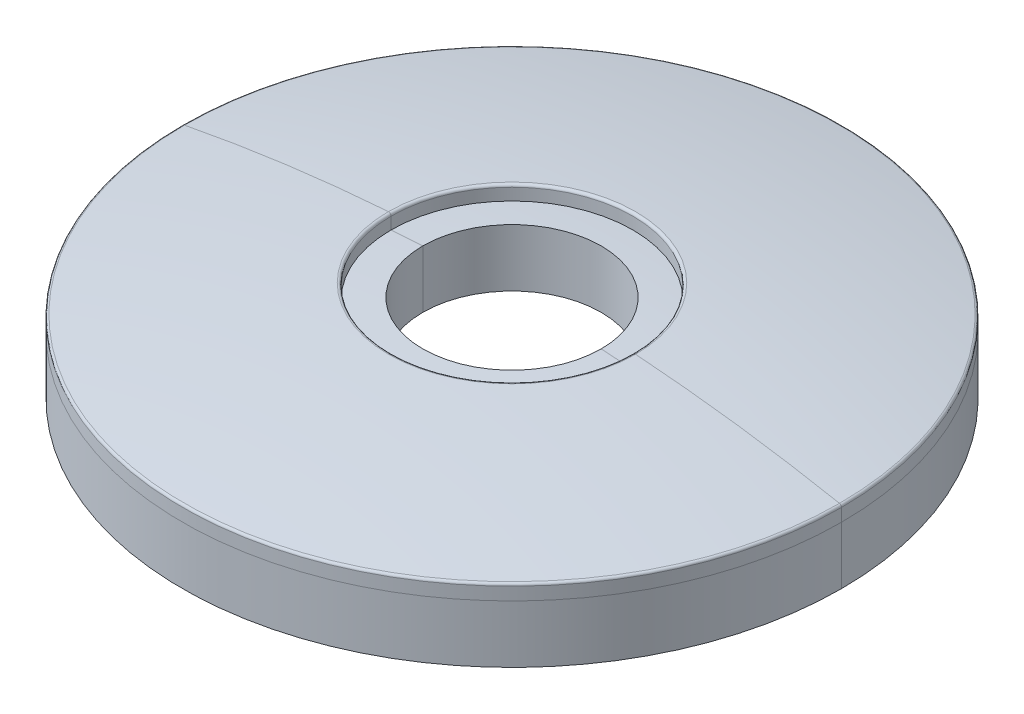
ISO-10303-21;
HEADER;
FILE_DESCRIPTION(('STEP AP214'),'2;1');
FILE_NAME('part.step','',(''),(''),'','','');
FILE_SCHEMA(('AUTOMOTIVE_DESIGN { 1 0 10303 214 1 1 1 1 }'));
ENDSEC;
DATA;
#1=APPLICATION_CONTEXT('core data for automotive mechanical design processes');
#2=APPLICATION_PROTOCOL_DEFINITION('international standard','automotive_design',2000,#1);
#3=PRODUCT_CONTEXT('',#1,'mechanical');
#4=PRODUCT('Part','Part','',(#3));
#5=PRODUCT_RELATED_PRODUCT_CATEGORY('part','',(#4));
#6=PRODUCT_DEFINITION_FORMATION('','',#4);
#7=PRODUCT_DEFINITION_CONTEXT('part definition',#1,'design');
#8=PRODUCT_DEFINITION('design','',#6,#7);
#9=PRODUCT_DEFINITION_SHAPE('','',#8);
#10=(LENGTH_UNIT() NAMED_UNIT(*) SI_UNIT(.MILLI.,.METRE.));
#11=(NAMED_UNIT(*) PLANE_ANGLE_UNIT() SI_UNIT($,.RADIAN.));
#12=(NAMED_UNIT(*) SI_UNIT($,.STERADIAN.) SOLID_ANGLE_UNIT());
#13=UNCERTAINTY_MEASURE_WITH_UNIT(LENGTH_MEASURE(1.E-05),#10,'distance_accuracy_value','');
#14=(GEOMETRIC_REPRESENTATION_CONTEXT(3) GLOBAL_UNCERTAINTY_ASSIGNED_CONTEXT((#13)) GLOBAL_UNIT_ASSIGNED_CONTEXT((#10,
#11,#12)) REPRESENTATION_CONTEXT('',''));
#15=CARTESIAN_POINT('',(0.,0.,0.));
#16=DIRECTION('',(0.,0.,1.));
#17=DIRECTION('',(1.,0.,0.));
#18=AXIS2_PLACEMENT_3D('',#15,#16,#17);
#19=CARTESIAN_POINT('',(0.,-1.4478,0.));
#20=DIRECTION('',(0.,-1.,0.));
#21=DIRECTION('',(1.,0.,0.));
#22=AXIS2_PLACEMENT_3D('',#19,#20,#21);
#23=CYLINDRICAL_SURFACE('',#22,2.5781);
#24=DIRECTION('',(0.,-1.,0.));
#25=VECTOR('',#24,1.);
#26=CARTESIAN_POINT('',(-2.5781,-1.4478,0.));
#27=LINE('',#26,#25);
#28=CARTESIAN_POINT('',(-2.5781,1.08019900598773,0.));
#29=VERTEX_POINT('',#28);
#30=CARTESIAN_POINT('',(-2.5781,-0.583230781246308,0.));
#31=VERTEX_POINT('',#30);
#32=EDGE_CURVE('P0_E150',#29,#31,#27,.T.);
#33=ORIENTED_EDGE('',*,*,#32,.F.);
#34=CARTESIAN_POINT('',(0.,1.08019900598773,0.));
#35=DIRECTION('',(0.,-1.,0.));
#36=DIRECTION('',(1.,0.,0.));
#37=AXIS2_PLACEMENT_3D('',#34,#35,#36);
#38=CIRCLE('',#37,2.5781);
#39=CARTESIAN_POINT('',(2.5781,1.08019900598773,0.));
#40=VERTEX_POINT('',#39);
#41=EDGE_CURVE('P0_E10',#40,#29,#38,.T.);
#42=ORIENTED_EDGE('',*,*,#41,.F.);
#43=DIRECTION('',(0.,-1.,0.));
#44=VECTOR('',#43,1.);
#45=CARTESIAN_POINT('',(2.5781,-1.4478,0.));
#46=LINE('',#45,#44);
#47=CARTESIAN_POINT('',(2.5781,-0.583230781246306,0.));
#48=VERTEX_POINT('',#47);
#49=EDGE_CURVE('P0_E103',#40,#48,#46,.T.);
#50=ORIENTED_EDGE('',*,*,#49,.T.);
#51=CARTESIAN_POINT('',(0.,-0.583230781246307,0.));
#52=DIRECTION('',(0.,-1.,0.));
#53=DIRECTION('',(1.,0.,0.));
#54=AXIS2_PLACEMENT_3D('',#51,#52,#53);
#55=CIRCLE('',#54,2.5781);
#56=EDGE_CURVE('P0_E111',#48,#31,#55,.T.);
#57=ORIENTED_EDGE('',*,*,#56,.T.);
#58=EDGE_LOOP('',(#33,#42,#50,#57));
#59=FACE_BOUND('',#58,.T.);
#60=ADVANCED_FACE('P0_F16',(#59),#23,.F.);
#61=CARTESIAN_POINT('',(0.,-47.9768941011998,0.));
#62=DIRECTION('',(0.,0.,-1.));
#63=DIRECTION('',(-1.,0.,0.));
#64=AXIS2_PLACEMENT_3D('',#61,#62,#63);
#65=SPHERICAL_SURFACE('',#64,49.1247899103626);
#66=CARTESIAN_POINT('',(0.,-47.9768941011998,0.));
#67=DIRECTION('',(0.,0.,-1.));
#68=DIRECTION('',(-1.,0.,0.));
#69=AXIS2_PLACEMENT_3D('',#66,#67,#68);
#70=CIRCLE('',#69,49.1247899103626);
#71=CARTESIAN_POINT('',(9.525,0.215629787234049,0.));
#72=VERTEX_POINT('',#71);
#73=EDGE_CURVE('P0_E97',#40,#72,#70,.T.);
#74=ORIENTED_EDGE('',*,*,#73,.F.);
#75=ORIENTED_EDGE('',*,*,#41,.T.);
#76=CARTESIAN_POINT('',(0.,-47.9768941011998,0.));
#77=DIRECTION('',(0.,0.,1.));
#78=DIRECTION('',(1.,0.,0.));
#79=AXIS2_PLACEMENT_3D('',#76,#77,#78);
#80=CIRCLE('',#79,49.1247899103626);
#81=CARTESIAN_POINT('',(-9.525,0.215629787234043,0.));
#82=VERTEX_POINT('',#81);
#83=EDGE_CURVE('P0_E87',#29,#82,#80,.T.);
#84=ORIENTED_EDGE('',*,*,#83,.T.);
#85=CARTESIAN_POINT('',(0.,0.215629787234047,0.));
#86=DIRECTION('',(0.,-1.,0.));
#87=DIRECTION('',(1.,0.,0.));
#88=AXIS2_PLACEMENT_3D('',#85,#86,#87);
#89=CIRCLE('',#88,9.525);
#90=EDGE_CURVE('P0_E78',#72,#82,#89,.T.);
#91=ORIENTED_EDGE('',*,*,#90,.F.);
#92=EDGE_LOOP('',(#74,#75,#84,#91));
#93=FACE_BOUND('',#92,.T.);
#94=ADVANCED_FACE('P0_F90',(#93),#65,.T.);
#95=CARTESIAN_POINT('',(0.,-1.4478,0.));
#96=DIRECTION('',(0.,-1.,0.));
#97=DIRECTION('',(1.,0.,0.));
#98=AXIS2_PLACEMENT_3D('',#95,#96,#97);
#99=CYLINDRICAL_SURFACE('',#98,9.525);
#100=DIRECTION('',(0.,-1.,0.));
#101=VECTOR('',#100,1.);
#102=CARTESIAN_POINT('',(-9.525,-1.4478,0.));
#103=LINE('',#102,#101);
#104=CARTESIAN_POINT('',(-9.525,-1.4478,0.));
#105=VERTEX_POINT('',#104);
#106=EDGE_CURVE('P0_E67',#82,#105,#103,.T.);
#107=ORIENTED_EDGE('',*,*,#106,.F.);
#108=CARTESIAN_POINT('',(0.,0.215629787234047,0.));
#109=DIRECTION('',(0.,-1.,0.));
#110=DIRECTION('',(1.,0.,0.));
#111=AXIS2_PLACEMENT_3D('',#108,#109,#110);
#112=CIRCLE('',#111,9.525);
#113=EDGE_CURVE('P0_E72',#82,#72,#112,.T.);
#114=ORIENTED_EDGE('',*,*,#113,.T.);
#115=DIRECTION('',(0.,-1.,0.));
#116=VECTOR('',#115,1.);
#117=CARTESIAN_POINT('',(9.525,-1.4478,0.));
#118=LINE('',#117,#116);
#119=CARTESIAN_POINT('',(9.52499999999988,-1.4478,0.));
#120=VERTEX_POINT('',#119);
#121=EDGE_CURVE('P0_E83',#72,#120,#118,.T.);
#122=ORIENTED_EDGE('',*,*,#121,.T.);
#123=CARTESIAN_POINT('',(0.,-1.4478,0.));
#124=DIRECTION('',(0.,-1.,0.));
#125=DIRECTION('',(1.,0.,0.));
#126=AXIS2_PLACEMENT_3D('',#123,#124,#125);
#127=CIRCLE('',#126,9.525);
#128=EDGE_CURVE('P0_E26',#105,#120,#127,.T.);
#129=ORIENTED_EDGE('',*,*,#128,.F.);
#130=EDGE_LOOP('',(#107,#114,#122,#129));
#131=FACE_BOUND('',#130,.T.);
#132=ADVANCED_FACE('P0_F69',(#131),#99,.T.);
#133=CARTESIAN_POINT('',(-1.04083408558608E-13,-49.640323888433,0.));
#134=DIRECTION('',(0.,0.,-1.));
#135=DIRECTION('',(-1.,0.,0.));
#136=AXIS2_PLACEMENT_3D('',#133,#134,#135);
#137=SPHERICAL_SURFACE('',#136,49.1247899103618);
#138=CARTESIAN_POINT('',(-1.04083408558608E-13,-49.640323888433,0.));
#139=DIRECTION('',(0.,0.,-1.));
#140=DIRECTION('',(-1.,0.,0.));
#141=AXIS2_PLACEMENT_3D('',#138,#139,#140);
#142=CIRCLE('',#141,49.1247899103618);
#143=EDGE_CURVE('P0_E116',#48,#120,#142,.T.);
#144=ORIENTED_EDGE('',*,*,#143,.F.);
#145=CARTESIAN_POINT('',(0.,-0.583230781246307,0.));
#146=DIRECTION('',(0.,-1.,0.));
#147=DIRECTION('',(1.,0.,0.));
#148=AXIS2_PLACEMENT_3D('',#145,#146,#147);
#149=CIRCLE('',#148,2.5781);
#150=EDGE_CURVE('P0_E130',#31,#48,#149,.T.);
#151=ORIENTED_EDGE('',*,*,#150,.F.);
#152=CARTESIAN_POINT('',(-1.04083408558608E-13,-49.640323888433,0.));
#153=DIRECTION('',(0.,0.,1.));
#154=DIRECTION('',(1.,0.,0.));
#155=AXIS2_PLACEMENT_3D('',#152,#153,#154);
#156=CIRCLE('',#155,49.1247899103618);
#157=EDGE_CURVE('P0_E19',#31,#105,#156,.T.);
#158=ORIENTED_EDGE('',*,*,#157,.T.);
#159=ORIENTED_EDGE('',*,*,#128,.T.);
#160=EDGE_LOOP('',(#144,#151,#158,#159));
#161=FACE_BOUND('',#160,.T.);
#162=ADVANCED_FACE('P0_F128',(#161),#137,.F.);
#163=CARTESIAN_POINT('',(-1.04083408558608E-13,-49.640323888433,0.));
#164=DIRECTION('',(0.,0.,-1.));
#165=DIRECTION('',(-1.,0.,0.));
#166=AXIS2_PLACEMENT_3D('',#163,#164,#165);
#167=SPHERICAL_SURFACE('',#166,49.1247899103618);
#168=ORIENTED_EDGE('',*,*,#56,.F.);
#169=ORIENTED_EDGE('',*,*,#143,.T.);
#170=CARTESIAN_POINT('',(0.,-1.4478,0.));
#171=DIRECTION('',(0.,-1.,0.));
#172=DIRECTION('',(1.,0.,0.));
#173=AXIS2_PLACEMENT_3D('',#170,#171,#172);
#174=CIRCLE('',#173,9.525);
#175=EDGE_CURVE('P0_E77',#120,#105,#174,.T.);
#176=ORIENTED_EDGE('',*,*,#175,.T.);
#177=ORIENTED_EDGE('',*,*,#157,.F.);
#178=EDGE_LOOP('',(#168,#169,#176,#177));
#179=FACE_BOUND('',#178,.T.);
#180=ADVANCED_FACE('P0_F132',(#179),#167,.F.);
#181=CARTESIAN_POINT('',(0.,-1.4478,0.));
#182=DIRECTION('',(0.,-1.,0.));
#183=DIRECTION('',(1.,0.,0.));
#184=AXIS2_PLACEMENT_3D('',#181,#182,#183);
#185=CYLINDRICAL_SURFACE('',#184,9.525);
#186=ORIENTED_EDGE('',*,*,#90,.T.);
#187=ORIENTED_EDGE('',*,*,#106,.T.);
#188=ORIENTED_EDGE('',*,*,#175,.F.);
#189=ORIENTED_EDGE('',*,*,#121,.F.);
#190=EDGE_LOOP('',(#186,#187,#188,#189));
#191=FACE_BOUND('',#190,.T.);
#192=ADVANCED_FACE('P0_F82',(#191),#185,.T.);
#193=CARTESIAN_POINT('',(0.,-47.9768941011998,0.));
#194=DIRECTION('',(0.,0.,-1.));
#195=DIRECTION('',(-1.,0.,0.));
#196=AXIS2_PLACEMENT_3D('',#193,#194,#195);
#197=SPHERICAL_SURFACE('',#196,49.1247899103626);
#198=CARTESIAN_POINT('',(0.,1.08019900598773,0.));
#199=DIRECTION('',(0.,-1.,0.));
#200=DIRECTION('',(1.,0.,0.));
#201=AXIS2_PLACEMENT_3D('',#198,#199,#200);
#202=CIRCLE('',#201,2.5781);
#203=EDGE_CURVE('P0_E154',#29,#40,#202,.T.);
#204=ORIENTED_EDGE('',*,*,#203,.T.);
#205=ORIENTED_EDGE('',*,*,#73,.T.);
#206=ORIENTED_EDGE('',*,*,#113,.F.);
#207=ORIENTED_EDGE('',*,*,#83,.F.);
#208=EDGE_LOOP('',(#204,#205,#206,#207));
#209=FACE_BOUND('',#208,.T.);
#210=ADVANCED_FACE('P0_F96',(#209),#197,.T.);
#211=CARTESIAN_POINT('',(0.,-1.4478,0.));
#212=DIRECTION('',(0.,-1.,0.));
#213=DIRECTION('',(1.,0.,0.));
#214=AXIS2_PLACEMENT_3D('',#211,#212,#213);
#215=CYLINDRICAL_SURFACE('',#214,2.5781);
#216=ORIENTED_EDGE('',*,*,#203,.F.);
#217=ORIENTED_EDGE('',*,*,#32,.T.);
#218=ORIENTED_EDGE('',*,*,#150,.T.);
#219=ORIENTED_EDGE('',*,*,#49,.F.);
#220=EDGE_LOOP('',(#216,#217,#218,#219));
#221=FACE_BOUND('',#220,.T.);
#222=ADVANCED_FACE('P0_F157',(#221),#215,.F.);
#223=CLOSED_SHELL('',(#60,#94,#132,#162,#180,#192,#210,#222));
#224=MANIFOLD_SOLID_BREP('P0_B1',#223);
#225=CARTESIAN_POINT('',(0.,1.36839752411728,0.));
#226=DIRECTION('',(0.,-1.,0.));
#227=DIRECTION('',(1.,0.,0.));
#228=AXIS2_PLACEMENT_3D('',#225,#226,#227);
#229=TOROIDAL_SURFACE('',#228,3.56643021276595,0.0739302127659569);
#230=CARTESIAN_POINT('',(-3.56643021276596,1.36839752411728,0.));
#231=DIRECTION('',(0.,0.,1.));
#232=DIRECTION('',(1.,0.,0.));
#233=AXIS2_PLACEMENT_3D('',#230,#231,#232);
#234=CIRCLE('',#233,0.073930212765957);
#235=CARTESIAN_POINT('',(-3.4925,1.36839752411728,0.));
#236=VERTEX_POINT('',#235);
#237=CARTESIAN_POINT('',(-3.57175961638411,1.44213539645365,0.));
#238=VERTEX_POINT('',#237);
#239=EDGE_CURVE('P1_E111',#236,#238,#234,.T.);
#240=ORIENTED_EDGE('',*,*,#239,.F.);
#241=CARTESIAN_POINT('',(0.,1.36839752411728,0.));
#242=DIRECTION('',(0.,1.,0.));
#243=DIRECTION('',(1.,0.,0.));
#244=AXIS2_PLACEMENT_3D('',#241,#242,#243);
#245=CIRCLE('',#244,3.4925);
#246=CARTESIAN_POINT('',(3.4925,1.36839752411729,0.));
#247=VERTEX_POINT('',#246);
#248=EDGE_CURVE('P1_E98',#247,#236,#245,.T.);
#249=ORIENTED_EDGE('',*,*,#248,.F.);
#250=CARTESIAN_POINT('',(3.56643021276595,1.36839752411729,0.));
#251=DIRECTION('',(0.,0.,-1.));
#252=DIRECTION('',(-1.,0.,0.));
#253=AXIS2_PLACEMENT_3D('',#250,#251,#252);
#254=CIRCLE('',#253,0.073930212765957);
#255=CARTESIAN_POINT('',(3.57175961638406,1.44213539645365,0.));
#256=VERTEX_POINT('',#255);
#257=EDGE_CURVE('P1_E121',#247,#256,#254,.T.);
#258=ORIENTED_EDGE('',*,*,#257,.T.);
#259=CARTESIAN_POINT('',(0.,1.44213539645365,0.));
#260=DIRECTION('',(0.,-1.,0.));
#261=DIRECTION('',(1.,0.,0.));
#262=AXIS2_PLACEMENT_3D('',#259,#260,#261);
#263=CIRCLE('',#262,3.57175961638409);
#264=EDGE_CURVE('P1_E113',#238,#256,#263,.T.);
#265=ORIENTED_EDGE('',*,*,#264,.F.);
#266=EDGE_LOOP('',(#240,#249,#258,#265));
#267=FACE_BOUND('',#266,.T.);
#268=ADVANCED_FACE('P1_F16',(#267),#229,.T.);
#269=CARTESIAN_POINT('',(0.,0.585998213065722,0.));
#270=DIRECTION('',(0.,-1.,0.));
#271=DIRECTION('',(1.,0.,0.));
#272=AXIS2_PLACEMENT_3D('',#269,#270,#271);
#273=TOROIDAL_SURFACE('',#272,9.45106978723404,0.0739302127659569);
#274=CARTESIAN_POINT('',(-9.45106978723404,0.58599821306572,0.));
#275=DIRECTION('',(0.,0.,1.));
#276=DIRECTION('',(1.,0.,0.));
#277=AXIS2_PLACEMENT_3D('',#274,#275,#276);
#278=CIRCLE('',#277,0.0739302127659575);
#279=CARTESIAN_POINT('',(-9.46519275123856,0.658566927036324,0.));
#280=VERTEX_POINT('',#279);
#281=CARTESIAN_POINT('',(-9.525,0.585998213065719,0.));
#282=VERTEX_POINT('',#281);
#283=EDGE_CURVE('P1_E147',#280,#282,#278,.T.);
#284=ORIENTED_EDGE('',*,*,#283,.F.);
#285=CARTESIAN_POINT('',(0.,0.658566927036329,0.));
#286=DIRECTION('',(0.,1.,0.));
#287=DIRECTION('',(1.,0.,0.));
#288=AXIS2_PLACEMENT_3D('',#285,#286,#287);
#289=CIRCLE('',#288,9.46519275123849);
#290=CARTESIAN_POINT('',(9.4651927512385,0.658566927036327,0.));
#291=VERTEX_POINT('',#290);
#292=EDGE_CURVE('P1_E177',#291,#280,#289,.T.);
#293=ORIENTED_EDGE('',*,*,#292,.F.);
#294=CARTESIAN_POINT('',(9.45106978723404,0.585998213065725,0.));
#295=DIRECTION('',(0.,0.,-1.));
#296=DIRECTION('',(-1.,0.,0.));
#297=AXIS2_PLACEMENT_3D('',#294,#295,#296);
#298=CIRCLE('',#297,0.0739302127659575);
#299=CARTESIAN_POINT('',(9.525,0.585998213065725,0.));
#300=VERTEX_POINT('',#299);
#301=EDGE_CURVE('P1_E152',#291,#300,#298,.T.);
#302=ORIENTED_EDGE('',*,*,#301,.T.);
#303=CARTESIAN_POINT('',(0.,0.585998213065722,0.));
#304=DIRECTION('',(0.,-1.,0.));
#305=DIRECTION('',(1.,0.,0.));
#306=AXIS2_PLACEMENT_3D('',#303,#304,#305);
#307=CIRCLE('',#306,9.525);
#308=EDGE_CURVE('P1_E10',#282,#300,#307,.T.);
#309=ORIENTED_EDGE('',*,*,#308,.F.);
#310=EDGE_LOOP('',(#284,#293,#302,#309));
#311=FACE_BOUND('',#310,.T.);
#312=ADVANCED_FACE('P1_F194',(#311),#273,.T.);
#313=CARTESIAN_POINT('',(0.,-1.4478,0.));
#314=DIRECTION('',(0.,-1.,0.));
#315=DIRECTION('',(1.,0.,0.));
#316=AXIS2_PLACEMENT_3D('',#313,#314,#315);
#317=CYLINDRICAL_SURFACE('',#316,9.525);
#318=DIRECTION('',(0.,-1.,0.));
#319=VECTOR('',#318,1.);
#320=CARTESIAN_POINT('',(-9.525,-1.4478,0.));
#321=LINE('',#320,#319);
#322=CARTESIAN_POINT('',(-9.525,0.215629787234043,0.));
#323=VERTEX_POINT('',#322);
#324=EDGE_CURVE('P1_E135',#282,#323,#321,.T.);
#325=ORIENTED_EDGE('',*,*,#324,.F.);
#326=ORIENTED_EDGE('',*,*,#308,.T.);
#327=DIRECTION('',(0.,-1.,0.));
#328=VECTOR('',#327,1.);
#329=CARTESIAN_POINT('',(9.525,-1.4478,0.));
#330=LINE('',#329,#328);
#331=CARTESIAN_POINT('',(9.525,0.215629787234045,0.));
#332=VERTEX_POINT('',#331);
#333=EDGE_CURVE('P1_E134',#300,#332,#330,.T.);
#334=ORIENTED_EDGE('',*,*,#333,.T.);
#335=CARTESIAN_POINT('',(0.,0.215629787234045,0.));
#336=DIRECTION('',(0.,-1.,0.));
#337=DIRECTION('',(1.,0.,0.));
#338=AXIS2_PLACEMENT_3D('',#335,#336,#337);
#339=CIRCLE('',#338,9.525);
#340=EDGE_CURVE('P1_E24',#323,#332,#339,.T.);
#341=ORIENTED_EDGE('',*,*,#340,.F.);
#342=EDGE_LOOP('',(#325,#326,#334,#341));
#343=FACE_BOUND('',#342,.T.);
#344=ADVANCED_FACE('P1_F204',(#343),#317,.T.);
#345=CARTESIAN_POINT('',(0.,-47.9768941011998,0.));
#346=DIRECTION('',(0.,0.,-1.));
#347=DIRECTION('',(-1.,0.,0.));
#348=AXIS2_PLACEMENT_3D('',#345,#346,#347);
#349=SPHERICAL_SURFACE('',#348,49.1247899103626);
#350=CARTESIAN_POINT('',(0.,-47.9768941011998,0.));
#351=DIRECTION('',(0.,0.,-1.));
#352=DIRECTION('',(-1.,0.,0.));
#353=AXIS2_PLACEMENT_3D('',#350,#351,#352);
#354=CIRCLE('',#353,49.1247899103626);
#355=CARTESIAN_POINT('',(3.4925,1.023589850362,0.));
#356=VERTEX_POINT('',#355);
#357=EDGE_CURVE('P1_E128',#356,#332,#354,.T.);
#358=ORIENTED_EDGE('',*,*,#357,.F.);
#359=CARTESIAN_POINT('',(0.,1.02358985036199,0.));
#360=DIRECTION('',(0.,-1.,0.));
#361=DIRECTION('',(1.,0.,0.));
#362=AXIS2_PLACEMENT_3D('',#359,#360,#361);
#363=CIRCLE('',#362,3.4925);
#364=CARTESIAN_POINT('',(-3.4925,1.02358985036199,0.));
#365=VERTEX_POINT('',#364);
#366=EDGE_CURVE('P1_E37',#365,#356,#363,.T.);
#367=ORIENTED_EDGE('',*,*,#366,.F.);
#368=CARTESIAN_POINT('',(0.,-47.9768941011998,0.));
#369=DIRECTION('',(0.,0.,1.));
#370=DIRECTION('',(1.,0.,0.));
#371=AXIS2_PLACEMENT_3D('',#368,#369,#370);
#372=CIRCLE('',#371,49.1247899103626);
#373=EDGE_CURVE('P1_E107',#365,#323,#372,.T.);
#374=ORIENTED_EDGE('',*,*,#373,.T.);
#375=ORIENTED_EDGE('',*,*,#340,.T.);
#376=EDGE_LOOP('',(#358,#367,#374,#375));
#377=FACE_BOUND('',#376,.T.);
#378=ADVANCED_FACE('P1_F205',(#377),#349,.F.);
#379=CARTESIAN_POINT('',(0.,-1.4478,0.));
#380=DIRECTION('',(0.,-1.,0.));
#381=DIRECTION('',(1.,0.,0.));
#382=AXIS2_PLACEMENT_3D('',#379,#380,#381);
#383=CYLINDRICAL_SURFACE('',#382,3.4925);
#384=DIRECTION('',(0.,-1.,0.));
#385=VECTOR('',#384,1.);
#386=CARTESIAN_POINT('',(-3.4925,-1.4478,0.));
#387=LINE('',#386,#385);
#388=EDGE_CURVE('P1_E88',#236,#365,#387,.T.);
#389=ORIENTED_EDGE('',*,*,#388,.F.);
#390=CARTESIAN_POINT('',(0.,1.36839752411728,0.));
#391=DIRECTION('',(0.,1.,0.));
#392=DIRECTION('',(1.,0.,0.));
#393=AXIS2_PLACEMENT_3D('',#390,#391,#392);
#394=CIRCLE('',#393,3.4925);
#395=EDGE_CURVE('P1_E92',#236,#247,#394,.T.);
#396=ORIENTED_EDGE('',*,*,#395,.T.);
#397=DIRECTION('',(0.,-1.,0.));
#398=VECTOR('',#397,1.);
#399=CARTESIAN_POINT('',(3.4925,-1.4478,0.));
#400=LINE('',#399,#398);
#401=EDGE_CURVE('P1_E48',#247,#356,#400,.T.);
#402=ORIENTED_EDGE('',*,*,#401,.T.);
#403=CARTESIAN_POINT('',(0.,1.02358985036199,0.));
#404=DIRECTION('',(0.,-1.,0.));
#405=DIRECTION('',(1.,0.,0.));
#406=AXIS2_PLACEMENT_3D('',#403,#404,#405);
#407=CIRCLE('',#406,3.4925);
#408=EDGE_CURVE('P1_E94',#356,#365,#407,.T.);
#409=ORIENTED_EDGE('',*,*,#408,.T.);
#410=EDGE_LOOP('',(#389,#396,#402,#409));
#411=FACE_BOUND('',#410,.T.);
#412=ADVANCED_FACE('P1_F90',(#411),#383,.F.);
#413=CARTESIAN_POINT('',(0.,-47.9768941011998,0.));
#414=DIRECTION('',(0.,0.,-1.));
#415=DIRECTION('',(-1.,0.,0.));
#416=AXIS2_PLACEMENT_3D('',#413,#414,#415);
#417=SPHERICAL_SURFACE('',#416,49.5479358121725);
#418=CARTESIAN_POINT('',(0.,-47.9768941011998,0.));
#419=DIRECTION('',(0.,0.,-1.));
#420=DIRECTION('',(-1.,0.,0.));
#421=AXIS2_PLACEMENT_3D('',#418,#419,#420);
#422=CIRCLE('',#421,49.5479358121725);
#423=EDGE_CURVE('P1_E173',#256,#291,#422,.T.);
#424=ORIENTED_EDGE('',*,*,#423,.F.);
#425=CARTESIAN_POINT('',(0.,1.44213539645365,0.));
#426=DIRECTION('',(0.,-1.,0.));
#427=DIRECTION('',(1.,0.,0.));
#428=AXIS2_PLACEMENT_3D('',#425,#426,#427);
#429=CIRCLE('',#428,3.57175961638409);
#430=EDGE_CURVE('P1_E118',#256,#238,#429,.T.);
#431=ORIENTED_EDGE('',*,*,#430,.T.);
#432=CARTESIAN_POINT('',(0.,-47.9768941011998,0.));
#433=DIRECTION('',(0.,0.,1.));
#434=DIRECTION('',(1.,0.,0.));
#435=AXIS2_PLACEMENT_3D('',#432,#433,#434);
#436=CIRCLE('',#435,49.5479358121725);
#437=EDGE_CURVE('P1_E180',#238,#280,#436,.T.);
#438=ORIENTED_EDGE('',*,*,#437,.T.);
#439=CARTESIAN_POINT('',(0.,0.658566927036329,0.));
#440=DIRECTION('',(0.,1.,0.));
#441=DIRECTION('',(1.,0.,0.));
#442=AXIS2_PLACEMENT_3D('',#439,#440,#441);
#443=CIRCLE('',#442,9.46519275123849);
#444=EDGE_CURVE('P1_E141',#280,#291,#443,.T.);
#445=ORIENTED_EDGE('',*,*,#444,.T.);
#446=EDGE_LOOP('',(#424,#431,#438,#445));
#447=FACE_BOUND('',#446,.T.);
#448=ADVANCED_FACE('P1_F187',(#447),#417,.T.);
#449=CARTESIAN_POINT('',(0.,-47.9768941011998,0.));
#450=DIRECTION('',(0.,0.,-1.));
#451=DIRECTION('',(-1.,0.,0.));
#452=AXIS2_PLACEMENT_3D('',#449,#450,#451);
#453=SPHERICAL_SURFACE('',#452,49.5479358121725);
#454=ORIENTED_EDGE('',*,*,#264,.T.);
#455=ORIENTED_EDGE('',*,*,#423,.T.);
#456=ORIENTED_EDGE('',*,*,#292,.T.);
#457=ORIENTED_EDGE('',*,*,#437,.F.);
#458=EDGE_LOOP('',(#454,#455,#456,#457));
#459=FACE_BOUND('',#458,.T.);
#460=ADVANCED_FACE('P1_F191',(#459),#453,.T.);
#461=CARTESIAN_POINT('',(0.,-1.4478,0.));
#462=DIRECTION('',(0.,-1.,0.));
#463=DIRECTION('',(1.,0.,0.));
#464=AXIS2_PLACEMENT_3D('',#461,#462,#463);
#465=CYLINDRICAL_SURFACE('',#464,3.4925);
#466=ORIENTED_EDGE('',*,*,#248,.T.);
#467=ORIENTED_EDGE('',*,*,#388,.T.);
#468=ORIENTED_EDGE('',*,*,#366,.T.);
#469=ORIENTED_EDGE('',*,*,#401,.F.);
#470=EDGE_LOOP('',(#466,#467,#468,#469));
#471=FACE_BOUND('',#470,.T.);
#472=ADVANCED_FACE('P1_F102',(#471),#465,.F.);
#473=CARTESIAN_POINT('',(0.,-47.9768941011998,0.));
#474=DIRECTION('',(0.,0.,-1.));
#475=DIRECTION('',(-1.,0.,0.));
#476=AXIS2_PLACEMENT_3D('',#473,#474,#475);
#477=SPHERICAL_SURFACE('',#476,49.1247899103626);
#478=ORIENTED_EDGE('',*,*,#408,.F.);
#479=ORIENTED_EDGE('',*,*,#357,.T.);
#480=CARTESIAN_POINT('',(0.,0.215629787234045,0.));
#481=DIRECTION('',(0.,-1.,0.));
#482=DIRECTION('',(1.,0.,0.));
#483=AXIS2_PLACEMENT_3D('',#480,#481,#482);
#484=CIRCLE('',#483,9.525);
#485=EDGE_CURVE('P1_E131',#332,#323,#484,.T.);
#486=ORIENTED_EDGE('',*,*,#485,.T.);
#487=ORIENTED_EDGE('',*,*,#373,.F.);
#488=EDGE_LOOP('',(#478,#479,#486,#487));
#489=FACE_BOUND('',#488,.T.);
#490=ADVANCED_FACE('P1_F207',(#489),#477,.F.);
#491=CARTESIAN_POINT('',(0.,-1.4478,0.));
#492=DIRECTION('',(0.,-1.,0.));
#493=DIRECTION('',(1.,0.,0.));
#494=AXIS2_PLACEMENT_3D('',#491,#492,#493);
#495=CYLINDRICAL_SURFACE('',#494,9.525);
#496=CARTESIAN_POINT('',(0.,0.585998213065722,0.));
#497=DIRECTION('',(0.,-1.,0.));
#498=DIRECTION('',(1.,0.,0.));
#499=AXIS2_PLACEMENT_3D('',#496,#497,#498);
#500=CIRCLE('',#499,9.525);
#501=EDGE_CURVE('P1_E148',#300,#282,#500,.T.);
#502=ORIENTED_EDGE('',*,*,#501,.T.);
#503=ORIENTED_EDGE('',*,*,#324,.T.);
#504=ORIENTED_EDGE('',*,*,#485,.F.);
#505=ORIENTED_EDGE('',*,*,#333,.F.);
#506=EDGE_LOOP('',(#502,#503,#504,#505));
#507=FACE_BOUND('',#506,.T.);
#508=ADVANCED_FACE('P1_F201',(#507),#495,.T.);
#509=CARTESIAN_POINT('',(0.,0.585998213065722,0.));
#510=DIRECTION('',(0.,-1.,0.));
#511=DIRECTION('',(1.,0.,0.));
#512=AXIS2_PLACEMENT_3D('',#509,#510,#511);
#513=TOROIDAL_SURFACE('',#512,9.45106978723404,0.0739302127659569);
#514=ORIENTED_EDGE('',*,*,#444,.F.);
#515=ORIENTED_EDGE('',*,*,#283,.T.);
#516=ORIENTED_EDGE('',*,*,#501,.F.);
#517=ORIENTED_EDGE('',*,*,#301,.F.);
#518=EDGE_LOOP('',(#514,#515,#516,#517));
#519=FACE_BOUND('',#518,.T.);
#520=ADVANCED_FACE('P1_F198',(#519),#513,.T.);
#521=CARTESIAN_POINT('',(0.,1.36839752411728,0.));
#522=DIRECTION('',(0.,-1.,0.));
#523=DIRECTION('',(1.,0.,0.));
#524=AXIS2_PLACEMENT_3D('',#521,#522,#523);
#525=TOROIDAL_SURFACE('',#524,3.56643021276595,0.0739302127659569);
#526=ORIENTED_EDGE('',*,*,#395,.F.);
#527=ORIENTED_EDGE('',*,*,#239,.T.);
#528=ORIENTED_EDGE('',*,*,#430,.F.);
#529=ORIENTED_EDGE('',*,*,#257,.F.);
#530=EDGE_LOOP('',(#526,#527,#528,#529));
#531=FACE_BOUND('',#530,.T.);
#532=ADVANCED_FACE('P1_F120',(#531),#525,.T.);
#533=CLOSED_SHELL('',(#268,#312,#344,#378,#412,#448,#460,#472,#490,#508,#520,#532));
#534=MANIFOLD_SOLID_BREP('P1_B1',#533);
#535=ADVANCED_BREP_SHAPE_REPRESENTATION('',(#18,#224,#534),#14);
#536=SHAPE_DEFINITION_REPRESENTATION(#9,#535);
ENDSEC;
END-ISO-10303-21;
